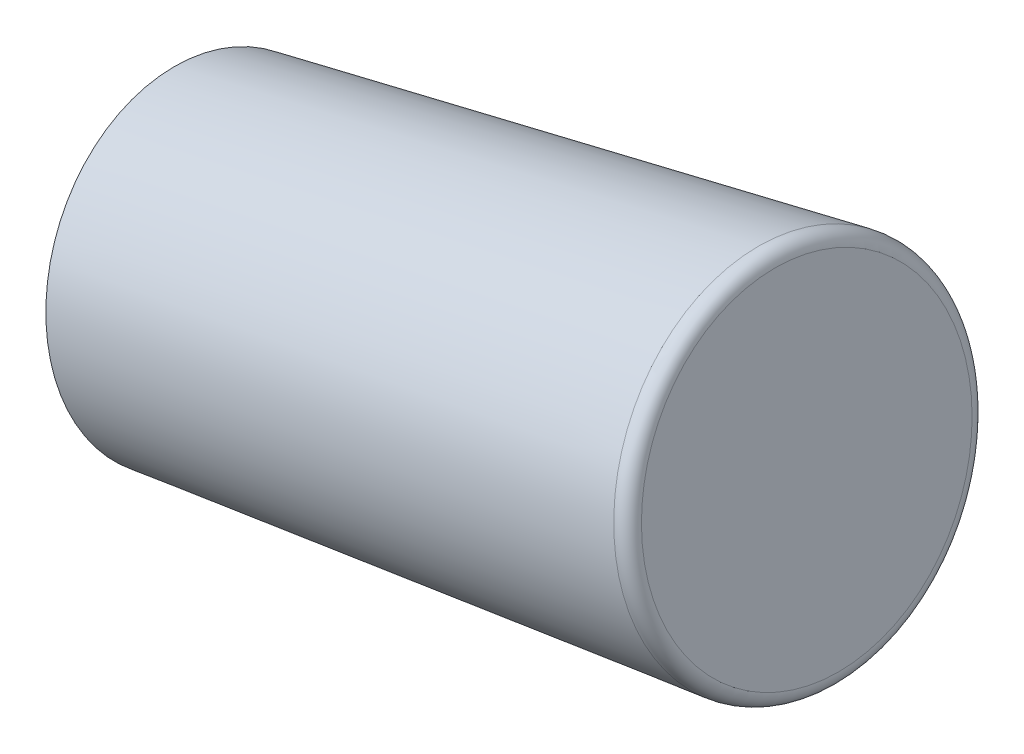
ISO-10303-21;
HEADER;
FILE_DESCRIPTION(('STEP AP214'),'2;1');
FILE_NAME('part.step','',(''),(''),'','','');
FILE_SCHEMA(('AUTOMOTIVE_DESIGN { 1 0 10303 214 1 1 1 1 }'));
ENDSEC;
DATA;
#1=APPLICATION_CONTEXT('core data for automotive mechanical design processes');
#2=APPLICATION_PROTOCOL_DEFINITION('international standard','automotive_design',2000,#1);
#3=PRODUCT_CONTEXT('',#1,'mechanical');
#4=PRODUCT('Part','Part','',(#3));
#5=PRODUCT_RELATED_PRODUCT_CATEGORY('part','',(#4));
#6=PRODUCT_DEFINITION_FORMATION('','',#4);
#7=PRODUCT_DEFINITION_CONTEXT('part definition',#1,'design');
#8=PRODUCT_DEFINITION('design','',#6,#7);
#9=PRODUCT_DEFINITION_SHAPE('','',#8);
#10=(LENGTH_UNIT() NAMED_UNIT(*) SI_UNIT(.MILLI.,.METRE.));
#11=(NAMED_UNIT(*) PLANE_ANGLE_UNIT() SI_UNIT($,.RADIAN.));
#12=(NAMED_UNIT(*) SI_UNIT($,.STERADIAN.) SOLID_ANGLE_UNIT());
#13=UNCERTAINTY_MEASURE_WITH_UNIT(LENGTH_MEASURE(1.E-05),#10,'distance_accuracy_value','');
#14=(GEOMETRIC_REPRESENTATION_CONTEXT(3) GLOBAL_UNCERTAINTY_ASSIGNED_CONTEXT((#13)) GLOBAL_UNIT_ASSIGNED_CONTEXT((#10,
#11,#12)) REPRESENTATION_CONTEXT('',''));
#15=CARTESIAN_POINT('',(0.,0.,0.));
#16=DIRECTION('',(0.,0.,1.));
#17=DIRECTION('',(1.,0.,0.));
#18=AXIS2_PLACEMENT_3D('',#15,#16,#17);
#19=CARTESIAN_POINT('',(13.7775921932589,28.0639809508041,-1.4432899320127E-12));
#20=DIRECTION('',(-0.98071477941016,-0.195444420351368,0.));
#21=DIRECTION('',(0.195444420351365,-0.980714779410178,0.));
#22=AXIS2_PLACEMENT_3D('',#19,#20,#21);
#23=PLANE('',#22);
#24=CARTESIAN_POINT('',(14.4749775748705,24.564570393688,7.77143627228583E-13));
#25=DIRECTION('',(-0.980714779410158,-0.195444420351368,0.));
#26=DIRECTION('',(-0.195444420351368,0.980714779410159,3.73451485588084E-13));
#27=AXIS2_PLACEMENT_3D('',#24,#25,#26);
#28=CIRCLE('',#27,3.56822338810166);
#29=CARTESIAN_POINT('',(13.7775898246933,28.0639801964071,-4.44089209850063E-13));
#30=VERTEX_POINT('',#29);
#31=CARTESIAN_POINT('',(15.1723685282364,21.0651613705077,8.88178419700125E-13));
#32=VERTEX_POINT('',#31);
#33=EDGE_CURVE('E40',#30,#32,#28,.T.);
#34=ORIENTED_EDGE('',*,*,#33,.F.);
#35=CARTESIAN_POINT('',(14.4749775748706,24.5645703936881,7.77143627228583E-13));
#36=DIRECTION('',(-0.980714779410158,-0.195444420351368,0.));
#37=DIRECTION('',(0.195444420351369,-0.980714779410159,-3.73329038981631E-13));
#38=AXIS2_PLACEMENT_3D('',#35,#36,#37);
#39=CIRCLE('',#38,3.56822321502364);
#40=EDGE_CURVE('E35',#32,#30,#39,.T.);
#41=ORIENTED_EDGE('',*,*,#40,.F.);
#42=EDGE_LOOP('',(#34,#41));
#43=FACE_BOUND('',#42,.T.);
#44=ADVANCED_FACE('F17',(#43),#23,.F.);
#45=CARTESIAN_POINT('',(1.24249999999615,21.9275000000021,2.66453525910038E-12));
#46=DIRECTION('',(0.98071477941016,0.195444420351368,0.));
#47=DIRECTION('',(-0.195444420351365,0.980714779410178,0.));
#48=AXIS2_PLACEMENT_3D('',#45,#46,#47);
#49=PLANE('',#48);
#50=CARTESIAN_POINT('',(1.24249999998083,21.9274999999963,-1.77635683940025E-12));
#51=DIRECTION('',(0.980714779410159,0.195444420351369,0.));
#52=DIRECTION('',(-0.195444420351365,0.980714779410179,0.));
#53=AXIS2_PLACEMENT_3D('',#50,#51,#52);
#54=CIRCLE('',#53,3.43575937748577);
#55=CARTESIAN_POINT('',(0.570999999981357,25.2969999999937,-1.77711973123384E-12));
#56=VERTEX_POINT('',#55);
#57=EDGE_CURVE('E29',#56,#56,#54,.T.);
#58=ORIENTED_EDGE('',*,*,#57,.F.);
#59=EDGE_LOOP('',(#58));
#60=FACE_BOUND('',#59,.T.);
#61=ADVANCED_FACE('F73',(#60),#49,.F.);
#62=CARTESIAN_POINT('',(14.1807631410489,24.5059370675829,7.7715611723761E-13));
#63=DIRECTION('',(-0.980714779410158,-0.195444420351368,0.));
#64=DIRECTION('',(0.195444420351369,-0.980714779410159,-3.73370053914497E-13));
#65=AXIS2_PLACEMENT_3D('',#62,#63,#64);
#66=TOROIDAL_SURFACE('',#65,3.56822304194562,0.299999999998711);
#67=CARTESIAN_POINT('',(14.17112021429,24.504015350614,1.66533453693773E-12));
#68=DIRECTION('',(0.980714779410158,0.195444420351368,0.));
#69=DIRECTION('',(-0.195444420351364,0.980714779410178,0.));
#70=AXIS2_PLACEMENT_3D('',#67,#68,#69);
#71=CIRCLE('',#70,3.86806186692503);
#72=CARTESIAN_POINT('',(13.4151291048256,28.2974807911803,1.66469037523593E-12));
#73=VERTEX_POINT('',#72);
#74=EDGE_CURVE('E11',#73,#73,#71,.F.);
#75=ORIENTED_EDGE('',*,*,#74,.F.);
#76=EDGE_LOOP('',(#75));
#77=FACE_BOUND('',#76,.T.);
#78=ORIENTED_EDGE('',*,*,#33,.T.);
#79=ORIENTED_EDGE('',*,*,#40,.T.);
#80=EDGE_LOOP('',(#78,#79));
#81=FACE_BOUND('',#80,.T.);
#82=ADVANCED_FACE('F39',(#77,#81),#66,.T.);
#83=CARTESIAN_POINT('',(14.17112021429,24.504015350614,1.66533453693773E-12));
#84=DIRECTION('',(0.980714779410159,0.195444420351369,0.));
#85=DIRECTION('',(-0.195444420351365,0.980714779410179,0.));
#86=AXIS2_PLACEMENT_3D('',#83,#84,#85);
#87=CONICAL_SURFACE('',#86,3.86806186692503,0.0327810360859347);
#88=ORIENTED_EDGE('',*,*,#57,.T.);
#89=EDGE_LOOP('',(#88));
#90=FACE_BOUND('',#89,.T.);
#91=ORIENTED_EDGE('',*,*,#74,.T.);
#92=EDGE_LOOP('',(#91));
#93=FACE_BOUND('',#92,.T.);
#94=ADVANCED_FACE('F72',(#90,#93),#87,.T.);
#95=CLOSED_SHELL('',(#44,#61,#82,#94));
#96=MANIFOLD_SOLID_BREP('B1',#95);
#97=ADVANCED_BREP_SHAPE_REPRESENTATION('',(#18,#96),#14);
#98=SHAPE_DEFINITION_REPRESENTATION(#9,#97);
ENDSEC;
END-ISO-10303-21;
